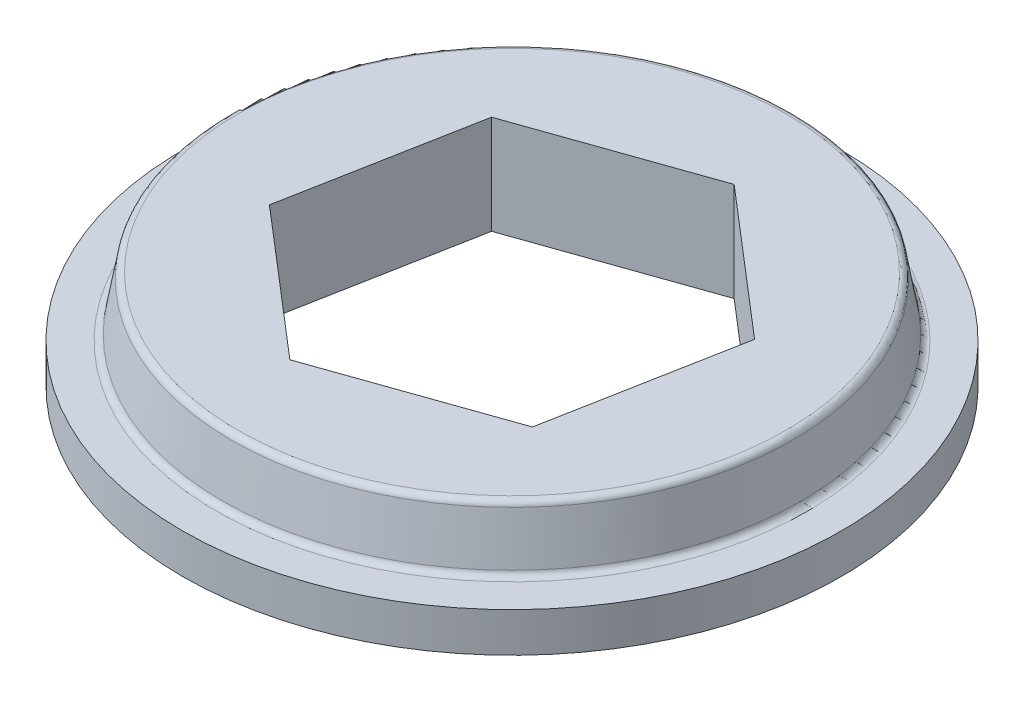
ISO-10303-21;
HEADER;
FILE_DESCRIPTION(('STEP AP214'),'2;1');
FILE_NAME('part.step','',(''),(''),'','','');
FILE_SCHEMA(('AUTOMOTIVE_DESIGN { 1 0 10303 214 1 1 1 1 }'));
ENDSEC;
DATA;
#1=APPLICATION_CONTEXT('core data for automotive mechanical design processes');
#2=APPLICATION_PROTOCOL_DEFINITION('international standard','automotive_design',2000,#1);
#3=PRODUCT_CONTEXT('',#1,'mechanical');
#4=PRODUCT('Part','Part','',(#3));
#5=PRODUCT_RELATED_PRODUCT_CATEGORY('part','',(#4));
#6=PRODUCT_DEFINITION_FORMATION('','',#4);
#7=PRODUCT_DEFINITION_CONTEXT('part definition',#1,'design');
#8=PRODUCT_DEFINITION('design','',#6,#7);
#9=PRODUCT_DEFINITION_SHAPE('','',#8);
#10=(LENGTH_UNIT() NAMED_UNIT(*) SI_UNIT(.MILLI.,.METRE.));
#11=(NAMED_UNIT(*) PLANE_ANGLE_UNIT() SI_UNIT($,.RADIAN.));
#12=(NAMED_UNIT(*) SI_UNIT($,.STERADIAN.) SOLID_ANGLE_UNIT());
#13=UNCERTAINTY_MEASURE_WITH_UNIT(LENGTH_MEASURE(1.E-05),#10,'distance_accuracy_value','');
#14=(GEOMETRIC_REPRESENTATION_CONTEXT(3) GLOBAL_UNCERTAINTY_ASSIGNED_CONTEXT((#13)) GLOBAL_UNIT_ASSIGNED_CONTEXT((#10,
#11,#12)) REPRESENTATION_CONTEXT('',''));
#15=CARTESIAN_POINT('',(0.,0.,0.));
#16=DIRECTION('',(0.,0.,1.));
#17=DIRECTION('',(1.,0.,0.));
#18=AXIS2_PLACEMENT_3D('',#15,#16,#17);
#19=CARTESIAN_POINT('',(0.,3.81,0.));
#20=DIRECTION('',(0.,-1.,0.));
#21=DIRECTION('',(0.,0.,-1.));
#22=AXIS2_PLACEMENT_3D('',#19,#20,#21);
#23=PLANE('',#22);
#24=CARTESIAN_POINT('',(0.,3.81,0.));
#25=DIRECTION('',(0.,-1.,0.));
#26=DIRECTION('',(0.,0.,-1.));
#27=AXIS2_PLACEMENT_3D('',#24,#25,#26);
#28=CIRCLE('',#27,10.5597852157814);
#29=CARTESIAN_POINT('',(0.,3.81,-10.5597852157814));
#30=VERTEX_POINT('',#29);
#31=EDGE_CURVE('E145',#30,#30,#28,.F.);
#32=ORIENTED_EDGE('',*,*,#31,.T.);
#33=EDGE_LOOP('',(#32));
#34=FACE_BOUND('',#33,.T.);
#35=DIRECTION('',(0.184731435516651,0.,-0.982789039790309));
#36=VECTOR('',#35,1.);
#37=CARTESIAN_POINT('',(5.56345277812035,3.81,4.77612044644587));
#38=LINE('',#37,#36);
#39=CARTESIAN_POINT('',(5.56345277812035,3.81,4.77612044644587));
#40=VERTEX_POINT('',#39);
#41=CARTESIAN_POINT('',(6.91796802721657,3.81,-2.4300312153844));
#42=VERTEX_POINT('',#41);
#43=EDGE_CURVE('E120',#40,#42,#38,.T.);
#44=ORIENTED_EDGE('',*,*,#43,.F.);
#45=DIRECTION('',(0.943485992777648,0.,-0.331412403860168));
#46=VECTOR('',#45,1.);
#47=CARTESIAN_POINT('',(-1.35451524909622,3.81,7.20615166183027));
#48=LINE('',#47,#46);
#49=CARTESIAN_POINT('',(-1.35451524909622,3.81,7.20615166183027));
#50=VERTEX_POINT('',#49);
#51=EDGE_CURVE('E49',#50,#40,#48,.T.);
#52=ORIENTED_EDGE('',*,*,#51,.F.);
#53=DIRECTION('',(0.758754557260997,0.,0.651376635930141));
#54=VECTOR('',#53,1.);
#55=CARTESIAN_POINT('',(-6.91796802721657,3.81,2.4300312153844));
#56=LINE('',#55,#54);
#57=CARTESIAN_POINT('',(-6.91796802721657,3.81,2.4300312153844));
#58=VERTEX_POINT('',#57);
#59=EDGE_CURVE('E106',#58,#50,#56,.T.);
#60=ORIENTED_EDGE('',*,*,#59,.F.);
#61=DIRECTION('',(-0.184731435516651,0.,0.982789039790309));
#62=VECTOR('',#61,1.);
#63=CARTESIAN_POINT('',(-5.56345277812035,3.81,-4.77612044644587));
#64=LINE('',#63,#62);
#65=CARTESIAN_POINT('',(-5.56345277812035,3.81,-4.77612044644587));
#66=VERTEX_POINT('',#65);
#67=EDGE_CURVE('E109',#66,#58,#64,.T.);
#68=ORIENTED_EDGE('',*,*,#67,.F.);
#69=DIRECTION('',(-0.943485992777649,0.,0.331412403860168));
#70=VECTOR('',#69,1.);
#71=CARTESIAN_POINT('',(1.35451524909622,3.81,-7.20615166183027));
#72=LINE('',#71,#70);
#73=CARTESIAN_POINT('',(1.35451524909622,3.81,-7.20615166183027));
#74=VERTEX_POINT('',#73);
#75=EDGE_CURVE('E125',#74,#66,#72,.T.);
#76=ORIENTED_EDGE('',*,*,#75,.F.);
#77=DIRECTION('',(-0.758754557260998,0.,-0.651376635930141));
#78=VECTOR('',#77,1.);
#79=CARTESIAN_POINT('',(6.91796802721657,3.81,-2.4300312153844));
#80=LINE('',#79,#78);
#81=EDGE_CURVE('E122',#42,#74,#80,.T.);
#82=ORIENTED_EDGE('',*,*,#81,.F.);
#83=EDGE_LOOP('',(#44,#52,#60,#68,#76,#82));
#84=FACE_BOUND('',#83,.T.);
#85=ADVANCED_FACE('F34',(#34,#84),#23,.F.);
#86=CARTESIAN_POINT('',(0.,1.524,0.));
#87=DIRECTION('',(0.,-1.,0.));
#88=DIRECTION('',(0.,0.,-1.));
#89=AXIS2_PLACEMENT_3D('',#86,#87,#88);
#90=CONICAL_SURFACE('',#89,11.176,0.17453292519943);
#91=CARTESIAN_POINT('',(0.,3.6001066371274,0.));
#92=DIRECTION('',(0.,1.,0.));
#93=DIRECTION('',(0.,0.,1.));
#94=AXIS2_PLACEMENT_3D('',#91,#92,#93);
#95=CIRCLE('',#94,10.8099263850465);
#96=CARTESIAN_POINT('',(0.,3.6001066371274,10.8099263850465));
#97=VERTEX_POINT('',#96);
#98=EDGE_CURVE('E42',#97,#97,#95,.F.);
#99=ORIENTED_EDGE('',*,*,#98,.T.);
#100=EDGE_LOOP('',(#99));
#101=FACE_BOUND('',#100,.T.);
#102=CARTESIAN_POINT('',(0.,1.7338933628726,0.));
#103=DIRECTION('',(0.,-1.,0.));
#104=DIRECTION('',(0.,0.,-1.));
#105=AXIS2_PLACEMENT_3D('',#102,#103,#104);
#106=CIRCLE('',#105,11.1389901370539);
#107=CARTESIAN_POINT('',(0.,1.7338933628726,-11.1389901370539));
#108=VERTEX_POINT('',#107);
#109=EDGE_CURVE('E148',#108,#108,#106,.F.);
#110=ORIENTED_EDGE('',*,*,#109,.T.);
#111=EDGE_LOOP('',(#110));
#112=FACE_BOUND('',#111,.T.);
#113=ADVANCED_FACE('F153',(#101,#112),#90,.T.);
#114=CARTESIAN_POINT('',(0.,1.524,-11.176));
#115=DIRECTION('',(0.,-1.,0.));
#116=DIRECTION('',(0.,0.,-1.));
#117=AXIS2_PLACEMENT_3D('',#114,#115,#116);
#118=PLANE('',#117);
#119=CARTESIAN_POINT('',(0.,1.524,0.));
#120=DIRECTION('',(0.,-1.,0.));
#121=DIRECTION('',(0.,0.,-1.));
#122=AXIS2_PLACEMENT_3D('',#119,#120,#121);
#123=CIRCLE('',#122,11.389131306319);
#124=CARTESIAN_POINT('',(0.,1.524,-11.389131306319));
#125=VERTEX_POINT('',#124);
#126=EDGE_CURVE('E11',#125,#125,#123,.T.);
#127=ORIENTED_EDGE('',*,*,#126,.T.);
#128=EDGE_LOOP('',(#127));
#129=FACE_BOUND('',#128,.T.);
#130=CARTESIAN_POINT('',(0.,1.524,0.));
#131=DIRECTION('',(0.,1.,0.));
#132=DIRECTION('',(0.,0.,1.));
#133=AXIS2_PLACEMENT_3D('',#130,#131,#132);
#134=CIRCLE('',#133,12.7);
#135=CARTESIAN_POINT('',(0.,1.524,12.7));
#136=VERTEX_POINT('',#135);
#137=EDGE_CURVE('E142',#136,#136,#134,.T.);
#138=ORIENTED_EDGE('',*,*,#137,.T.);
#139=EDGE_LOOP('',(#138));
#140=FACE_BOUND('',#139,.T.);
#141=ADVANCED_FACE('F197',(#129,#140),#118,.F.);
#142=CARTESIAN_POINT('',(0.,8.52487500000163,0.));
#143=DIRECTION('',(0.,1.,0.));
#144=DIRECTION('',(0.,0.,1.));
#145=AXIS2_PLACEMENT_3D('',#142,#143,#144);
#146=CYLINDRICAL_SURFACE('',#145,12.7);
#147=ORIENTED_EDGE('',*,*,#137,.F.);
#148=EDGE_LOOP('',(#147));
#149=FACE_BOUND('',#148,.T.);
#150=CARTESIAN_POINT('',(0.,0.,0.));
#151=DIRECTION('',(0.,1.,0.));
#152=DIRECTION('',(0.,0.,1.));
#153=AXIS2_PLACEMENT_3D('',#150,#151,#152);
#154=CIRCLE('',#153,12.7);
#155=CARTESIAN_POINT('',(0.,0.,12.7));
#156=VERTEX_POINT('',#155);
#157=EDGE_CURVE('E132',#156,#156,#154,.T.);
#158=ORIENTED_EDGE('',*,*,#157,.T.);
#159=EDGE_LOOP('',(#158));
#160=FACE_BOUND('',#159,.T.);
#161=ADVANCED_FACE('F194',(#149,#160),#146,.T.);
#162=CARTESIAN_POINT('',(0.,0.,-12.7));
#163=DIRECTION('',(0.,1.,0.));
#164=DIRECTION('',(0.,0.,1.));
#165=AXIS2_PLACEMENT_3D('',#162,#163,#164);
#166=PLANE('',#165);
#167=DIRECTION('',(0.758754557260997,0.,0.651376635930141));
#168=VECTOR('',#167,1.);
#169=CARTESIAN_POINT('',(-6.91796802721657,0.,2.4300312153844));
#170=LINE('',#169,#168);
#171=CARTESIAN_POINT('',(-6.91796802721657,0.,2.4300312153844));
#172=VERTEX_POINT('',#171);
#173=CARTESIAN_POINT('',(-1.35451524909622,0.,7.20615166183027));
#174=VERTEX_POINT('',#173);
#175=EDGE_CURVE('E95',#172,#174,#170,.T.);
#176=ORIENTED_EDGE('',*,*,#175,.T.);
#177=DIRECTION('',(0.943485992777648,0.,-0.331412403860168));
#178=VECTOR('',#177,1.);
#179=CARTESIAN_POINT('',(-1.35451524909622,0.,7.20615166183027));
#180=LINE('',#179,#178);
#181=CARTESIAN_POINT('',(5.56345277812035,0.,4.77612044644587));
#182=VERTEX_POINT('',#181);
#183=EDGE_CURVE('E89',#174,#182,#180,.T.);
#184=ORIENTED_EDGE('',*,*,#183,.T.);
#185=DIRECTION('',(0.184731435516651,0.,-0.982789039790309));
#186=VECTOR('',#185,1.);
#187=CARTESIAN_POINT('',(5.56345277812035,0.,4.77612044644587));
#188=LINE('',#187,#186);
#189=CARTESIAN_POINT('',(6.91796802721657,0.,-2.4300312153844));
#190=VERTEX_POINT('',#189);
#191=EDGE_CURVE('E98',#182,#190,#188,.T.);
#192=ORIENTED_EDGE('',*,*,#191,.T.);
#193=DIRECTION('',(-0.758754557260998,0.,-0.651376635930141));
#194=VECTOR('',#193,1.);
#195=CARTESIAN_POINT('',(6.91796802721657,0.,-2.4300312153844));
#196=LINE('',#195,#194);
#197=CARTESIAN_POINT('',(1.35451524909622,0.,-7.20615166183027));
#198=VERTEX_POINT('',#197);
#199=EDGE_CURVE('E57',#190,#198,#196,.T.);
#200=ORIENTED_EDGE('',*,*,#199,.T.);
#201=DIRECTION('',(-0.943485992777649,0.,0.331412403860168));
#202=VECTOR('',#201,1.);
#203=CARTESIAN_POINT('',(1.35451524909622,0.,-7.20615166183027));
#204=LINE('',#203,#202);
#205=CARTESIAN_POINT('',(-5.56345277812035,0.,-4.77612044644587));
#206=VERTEX_POINT('',#205);
#207=EDGE_CURVE('E113',#198,#206,#204,.T.);
#208=ORIENTED_EDGE('',*,*,#207,.T.);
#209=DIRECTION('',(-0.184731435516651,0.,0.982789039790309));
#210=VECTOR('',#209,1.);
#211=CARTESIAN_POINT('',(-5.56345277812035,0.,-4.77612044644587));
#212=LINE('',#211,#210);
#213=EDGE_CURVE('E116',#206,#172,#212,.T.);
#214=ORIENTED_EDGE('',*,*,#213,.T.);
#215=EDGE_LOOP('',(#176,#184,#192,#200,#208,#214));
#216=FACE_BOUND('',#215,.T.);
#217=ORIENTED_EDGE('',*,*,#157,.F.);
#218=EDGE_LOOP('',(#217));
#219=FACE_BOUND('',#218,.T.);
#220=ADVANCED_FACE('F102',(#216,#219),#166,.F.);
#221=CARTESIAN_POINT('',(-1.35451524909622,0.,7.20615166183027));
#222=DIRECTION('',(0.331412403860168,0.,0.943485992777649));
#223=DIRECTION('',(0.943485992777649,0.,-0.331412403860168));
#224=AXIS2_PLACEMENT_3D('',#221,#222,#223);
#225=PLANE('',#224);
#226=ORIENTED_EDGE('',*,*,#51,.T.);
#227=DIRECTION('',(0.,1.,0.));
#228=VECTOR('',#227,1.);
#229=CARTESIAN_POINT('',(5.56345277812035,0.,4.77612044644587));
#230=LINE('',#229,#228);
#231=EDGE_CURVE('E85',#182,#40,#230,.T.);
#232=ORIENTED_EDGE('',*,*,#231,.F.);
#233=ORIENTED_EDGE('',*,*,#183,.F.);
#234=DIRECTION('',(0.,1.,0.));
#235=VECTOR('',#234,1.);
#236=CARTESIAN_POINT('',(-1.35451524909622,0.,7.20615166183027));
#237=LINE('',#236,#235);
#238=EDGE_CURVE('E130',#174,#50,#237,.T.);
#239=ORIENTED_EDGE('',*,*,#238,.T.);
#240=EDGE_LOOP('',(#226,#232,#233,#239));
#241=FACE_BOUND('',#240,.T.);
#242=ADVANCED_FACE('F87',(#241),#225,.F.);
#243=CARTESIAN_POINT('',(-6.91796802721657,0.,2.4300312153844));
#244=DIRECTION('',(-0.651376635930141,0.,0.758754557260997));
#245=DIRECTION('',(0.758754557260998,0.,0.651376635930141));
#246=AXIS2_PLACEMENT_3D('',#243,#244,#245);
#247=PLANE('',#246);
#248=ORIENTED_EDGE('',*,*,#59,.T.);
#249=ORIENTED_EDGE('',*,*,#238,.F.);
#250=ORIENTED_EDGE('',*,*,#175,.F.);
#251=DIRECTION('',(0.,1.,0.));
#252=VECTOR('',#251,1.);
#253=CARTESIAN_POINT('',(-6.91796802721657,0.,2.4300312153844));
#254=LINE('',#253,#252);
#255=EDGE_CURVE('E133',#172,#58,#254,.T.);
#256=ORIENTED_EDGE('',*,*,#255,.T.);
#257=EDGE_LOOP('',(#248,#249,#250,#256));
#258=FACE_BOUND('',#257,.T.);
#259=ADVANCED_FACE('F176',(#258),#247,.F.);
#260=CARTESIAN_POINT('',(-5.56345277812035,0.,-4.77612044644587));
#261=DIRECTION('',(-0.982789039790309,0.,-0.184731435516651));
#262=DIRECTION('',(-0.184731435516651,0.,0.982789039790309));
#263=AXIS2_PLACEMENT_3D('',#260,#261,#262);
#264=PLANE('',#263);
#265=ORIENTED_EDGE('',*,*,#67,.T.);
#266=ORIENTED_EDGE('',*,*,#255,.F.);
#267=ORIENTED_EDGE('',*,*,#213,.F.);
#268=DIRECTION('',(0.,1.,0.));
#269=VECTOR('',#268,1.);
#270=CARTESIAN_POINT('',(-5.56345277812035,0.,-4.77612044644587));
#271=LINE('',#270,#269);
#272=EDGE_CURVE('E135',#206,#66,#271,.T.);
#273=ORIENTED_EDGE('',*,*,#272,.T.);
#274=EDGE_LOOP('',(#265,#266,#267,#273));
#275=FACE_BOUND('',#274,.T.);
#276=ADVANCED_FACE('F174',(#275),#264,.F.);
#277=CARTESIAN_POINT('',(1.35451524909622,0.,-7.20615166183027));
#278=DIRECTION('',(-0.331412403860168,0.,-0.943485992777648));
#279=DIRECTION('',(-0.943485992777649,0.,0.331412403860168));
#280=AXIS2_PLACEMENT_3D('',#277,#278,#279);
#281=PLANE('',#280);
#282=ORIENTED_EDGE('',*,*,#75,.T.);
#283=ORIENTED_EDGE('',*,*,#272,.F.);
#284=ORIENTED_EDGE('',*,*,#207,.F.);
#285=DIRECTION('',(0.,1.,0.));
#286=VECTOR('',#285,1.);
#287=CARTESIAN_POINT('',(1.35451524909622,0.,-7.20615166183027));
#288=LINE('',#287,#286);
#289=EDGE_CURVE('E137',#198,#74,#288,.T.);
#290=ORIENTED_EDGE('',*,*,#289,.T.);
#291=EDGE_LOOP('',(#282,#283,#284,#290));
#292=FACE_BOUND('',#291,.T.);
#293=ADVANCED_FACE('F171',(#292),#281,.F.);
#294=CARTESIAN_POINT('',(6.91796802721657,0.,-2.4300312153844));
#295=DIRECTION('',(0.651376635930141,0.,-0.758754557260997));
#296=DIRECTION('',(-0.758754557260998,0.,-0.651376635930141));
#297=AXIS2_PLACEMENT_3D('',#294,#295,#296);
#298=PLANE('',#297);
#299=ORIENTED_EDGE('',*,*,#81,.T.);
#300=ORIENTED_EDGE('',*,*,#289,.F.);
#301=ORIENTED_EDGE('',*,*,#199,.F.);
#302=DIRECTION('',(0.,1.,0.));
#303=VECTOR('',#302,1.);
#304=CARTESIAN_POINT('',(6.91796802721657,0.,-2.4300312153844));
#305=LINE('',#304,#303);
#306=EDGE_CURVE('E94',#190,#42,#305,.T.);
#307=ORIENTED_EDGE('',*,*,#306,.T.);
#308=EDGE_LOOP('',(#299,#300,#301,#307));
#309=FACE_BOUND('',#308,.T.);
#310=ADVANCED_FACE('F168',(#309),#298,.F.);
#311=CARTESIAN_POINT('',(5.56345277812035,0.,4.77612044644587));
#312=DIRECTION('',(0.982789039790309,0.,0.184731435516651));
#313=DIRECTION('',(0.184731435516651,0.,-0.982789039790309));
#314=AXIS2_PLACEMENT_3D('',#311,#312,#313);
#315=PLANE('',#314);
#316=ORIENTED_EDGE('',*,*,#43,.T.);
#317=ORIENTED_EDGE('',*,*,#306,.F.);
#318=ORIENTED_EDGE('',*,*,#191,.F.);
#319=ORIENTED_EDGE('',*,*,#231,.T.);
#320=EDGE_LOOP('',(#316,#317,#318,#319));
#321=FACE_BOUND('',#320,.T.);
#322=ADVANCED_FACE('F99',(#321),#315,.F.);
#323=CARTESIAN_POINT('',(0.,3.556,0.));
#324=DIRECTION('',(0.,-1.,0.));
#325=DIRECTION('',(0.,0.,-1.));
#326=AXIS2_PLACEMENT_3D('',#323,#324,#325);
#327=TOROIDAL_SURFACE('',#326,10.5597852157814,0.254);
#328=ORIENTED_EDGE('',*,*,#98,.F.);
#329=EDGE_LOOP('',(#328));
#330=FACE_BOUND('',#329,.T.);
#331=ORIENTED_EDGE('',*,*,#31,.F.);
#332=EDGE_LOOP('',(#331));
#333=FACE_BOUND('',#332,.T.);
#334=ADVANCED_FACE('F156',(#330,#333),#327,.T.);
#335=CARTESIAN_POINT('',(0.,1.778,0.));
#336=DIRECTION('',(0.,-1.,0.));
#337=DIRECTION('',(0.,0.,-1.));
#338=AXIS2_PLACEMENT_3D('',#335,#336,#337);
#339=TOROIDAL_SURFACE('',#338,11.389131306319,0.254);
#340=ORIENTED_EDGE('',*,*,#126,.F.);
#341=EDGE_LOOP('',(#340));
#342=FACE_BOUND('',#341,.T.);
#343=ORIENTED_EDGE('',*,*,#109,.F.);
#344=EDGE_LOOP('',(#343));
#345=FACE_BOUND('',#344,.T.);
#346=ADVANCED_FACE('F36',(#342,#345),#339,.F.);
#347=CLOSED_SHELL('',(#85,#113,#141,#161,#220,#242,#259,#276,#293,#310,#322,#334,#346));
#348=MANIFOLD_SOLID_BREP('B2',#347);
#349=ADVANCED_BREP_SHAPE_REPRESENTATION('',(#18,#348),#14);
#350=SHAPE_DEFINITION_REPRESENTATION(#9,#349);
ENDSEC;
END-ISO-10303-21;
